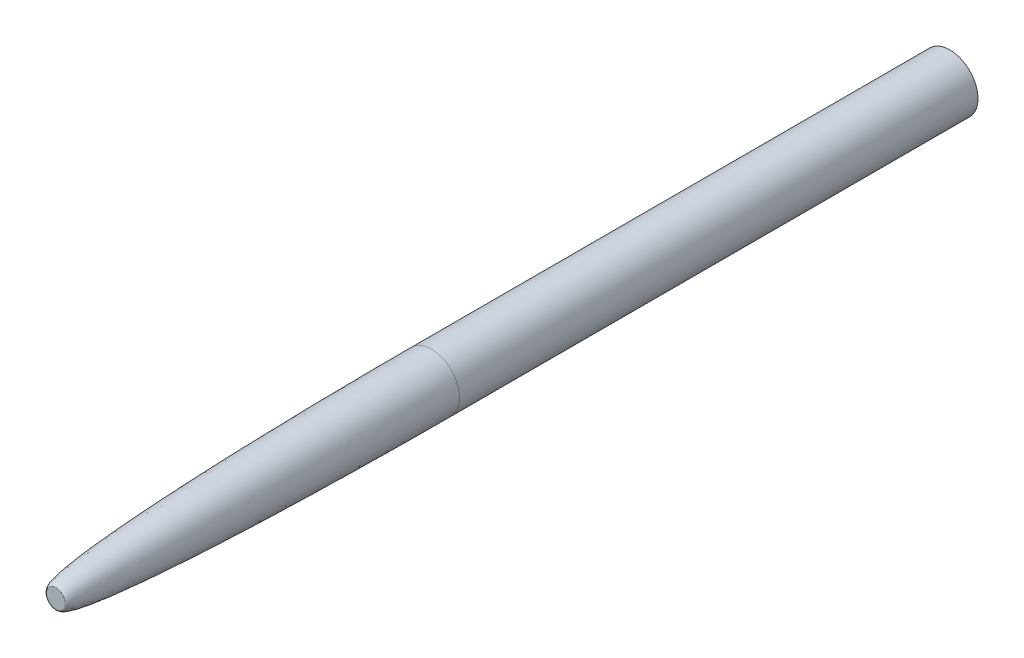
ISO-10303-21;
HEADER;
FILE_DESCRIPTION(('STEP AP214'),'2;1');
FILE_NAME('part.step','',(''),(''),'','','');
FILE_SCHEMA(('AUTOMOTIVE_DESIGN { 1 0 10303 214 1 1 1 1 }'));
ENDSEC;
DATA;
#1=APPLICATION_CONTEXT('core data for automotive mechanical design processes');
#2=APPLICATION_PROTOCOL_DEFINITION('international standard','automotive_design',2000,#1);
#3=PRODUCT_CONTEXT('',#1,'mechanical');
#4=PRODUCT('Part','Part','',(#3));
#5=PRODUCT_RELATED_PRODUCT_CATEGORY('part','',(#4));
#6=PRODUCT_DEFINITION_FORMATION('','',#4);
#7=PRODUCT_DEFINITION_CONTEXT('part definition',#1,'design');
#8=PRODUCT_DEFINITION('design','',#6,#7);
#9=PRODUCT_DEFINITION_SHAPE('','',#8);
#10=(LENGTH_UNIT() NAMED_UNIT(*) SI_UNIT(.MILLI.,.METRE.));
#11=(NAMED_UNIT(*) PLANE_ANGLE_UNIT() SI_UNIT($,.RADIAN.));
#12=(NAMED_UNIT(*) SI_UNIT($,.STERADIAN.) SOLID_ANGLE_UNIT());
#13=UNCERTAINTY_MEASURE_WITH_UNIT(LENGTH_MEASURE(1.E-05),#10,'distance_accuracy_value','');
#14=(GEOMETRIC_REPRESENTATION_CONTEXT(3) GLOBAL_UNCERTAINTY_ASSIGNED_CONTEXT((#13)) GLOBAL_UNIT_ASSIGNED_CONTEXT((#10,
#11,#12)) REPRESENTATION_CONTEXT('',''));
#15=CARTESIAN_POINT('',(0.,0.,0.));
#16=DIRECTION('',(0.,0.,1.));
#17=DIRECTION('',(1.,0.,0.));
#18=AXIS2_PLACEMENT_3D('',#15,#16,#17);
#19=CARTESIAN_POINT('',(0.,0.,23.8));
#20=DIRECTION('',(0.,0.,-1.));
#21=DIRECTION('',(-1.,0.,0.));
#22=AXIS2_PLACEMENT_3D('',#19,#20,#21);
#23=CYLINDRICAL_SURFACE('',#22,0.75);
#24=CARTESIAN_POINT('',(0.75,0.,13.8));
#25=CARTESIAN_POINT('',(0.75,0.196349017251001,13.8));
#26=CARTESIAN_POINT('',(0.669169807467412,0.39149036431241,13.8));
#27=CARTESIAN_POINT('',(0.39149036431241,0.669169807467412,13.8));
#28=CARTESIAN_POINT('',(0.196349017251005,0.75,13.8));
#29=CARTESIAN_POINT('',(-0.196349017251005,0.75,13.8));
#30=CARTESIAN_POINT('',(-0.391490364312412,0.66916980746741,13.8));
#31=CARTESIAN_POINT('',(-0.66916980746741,0.391490364312411,13.8));
#32=CARTESIAN_POINT('',(-0.75,0.196349017251005,13.8));
#33=CARTESIAN_POINT('',(-0.75,-0.196349017251005,13.8));
#34=CARTESIAN_POINT('',(-0.669169807467413,-0.391490364312408,13.8));
#35=CARTESIAN_POINT('',(-0.391490364312407,-0.669169807467414,13.8));
#36=CARTESIAN_POINT('',(-0.196349017251004,-0.75,13.8));
#37=CARTESIAN_POINT('',(0.196349017251007,-0.75,13.8));
#38=CARTESIAN_POINT('',(0.39149036431241,-0.669169807467411,13.8));
#39=CARTESIAN_POINT('',(0.669169807467408,-0.391490364312414,13.8));
#40=CARTESIAN_POINT('',(0.75,-0.196349017251001,13.8));
#41=CARTESIAN_POINT('',(0.75,0.,13.8));
#42=(BOUNDED_CURVE() B_SPLINE_CURVE(3,(#24,#25,#26,#27,#28,#29,#30,#31,#32,#33,#34,#35,#36,#37,
#38,#39,#40,#41),.UNSPECIFIED.,.T.,.F.) B_SPLINE_CURVE_WITH_KNOTS((4,2,2,2,2,2,2,2,4),(0.,
0.785398163397448,1.5707963267949,2.35619449019234,3.14159265358979,3.92699081698724,
4.71238898038469,5.49778714378214,6.28318530717959),
.UNSPECIFIED.) CURVE() GEOMETRIC_REPRESENTATION_ITEM() RATIONAL_B_SPLINE_CURVE((1.,1.,1.,1.,1.,
1.,1.,1.,1.,1.,1.,1.,1.,1.,1.,1.,1.,1.)) REPRESENTATION_ITEM(''));
#43=CARTESIAN_POINT('',(0.75,0.,13.8));
#44=VERTEX_POINT('',#43);
#45=EDGE_CURVE('E11',#44,#44,#42,.F.);
#46=ORIENTED_EDGE('',*,*,#45,.T.);
#47=EDGE_LOOP('',(#46));
#48=FACE_BOUND('',#47,.T.);
#49=CARTESIAN_POINT('',(0.,0.,0.));
#50=DIRECTION('',(0.,0.,1.));
#51=DIRECTION('',(1.,0.,0.));
#52=AXIS2_PLACEMENT_3D('',#49,#50,#51);
#53=CIRCLE('',#52,0.75);
#54=CARTESIAN_POINT('',(0.75,0.,0.));
#55=VERTEX_POINT('',#54);
#56=EDGE_CURVE('E54',#55,#55,#53,.T.);
#57=ORIENTED_EDGE('',*,*,#56,.T.);
#58=EDGE_LOOP('',(#57));
#59=FACE_BOUND('',#58,.T.);
#60=ADVANCED_FACE('F36',(#48,#59),#23,.T.);
#61=CARTESIAN_POINT('',(0.,0.,23.8));
#62=DIRECTION('',(0.,0.,1.));
#63=DIRECTION('',(1.,0.,0.));
#64=AXIS2_PLACEMENT_3D('',#61,#62,#63);
#65=PLANE('',#64);
#66=CARTESIAN_POINT('',(0.25,0.,23.8));
#67=CARTESIAN_POINT('',(0.25,-0.0654496724170002,23.8));
#68=CARTESIAN_POINT('',(0.223056602489137,-0.130496788104138,23.8));
#69=CARTESIAN_POINT('',(0.130496788104136,-0.223056602489137,23.8));
#70=CARTESIAN_POINT('',(0.0654496724170022,-0.25,23.8));
#71=CARTESIAN_POINT('',(-0.0654496724170014,-0.25,23.8));
#72=CARTESIAN_POINT('',(-0.130496788104136,-0.223056602489138,23.8));
#73=CARTESIAN_POINT('',(-0.223056602489137,-0.130496788104136,23.8));
#74=CARTESIAN_POINT('',(-0.25,-0.0654496724170018,23.8));
#75=CARTESIAN_POINT('',(-0.25,0.0654496724170018,23.8));
#76=CARTESIAN_POINT('',(-0.223056602489138,0.130496788104137,23.8));
#77=CARTESIAN_POINT('',(-0.130496788104137,0.223056602489136,23.8));
#78=CARTESIAN_POINT('',(-0.0654496724170018,0.25,23.8));
#79=CARTESIAN_POINT('',(0.0654496724170018,0.25,23.8));
#80=CARTESIAN_POINT('',(0.130496788104138,0.223056602489137,23.8));
#81=CARTESIAN_POINT('',(0.223056602489136,0.130496788104137,23.8));
#82=CARTESIAN_POINT('',(0.25,0.0654496724170002,23.8));
#83=CARTESIAN_POINT('',(0.25,0.,23.8));
#84=(BOUNDED_CURVE() B_SPLINE_CURVE(3,(#66,#67,#68,#69,#70,#71,#72,#73,#74,#75,#76,#77,#78,#79,
#80,#81,#82,#83),.UNSPECIFIED.,.T.,.F.) B_SPLINE_CURVE_WITH_KNOTS((4,2,2,2,2,2,2,2,4),(0.,
0.785398163397448,1.5707963267949,2.35619449019234,3.14159265358979,3.92699081698724,
4.71238898038469,5.49778714378214,6.28318530717959),
.UNSPECIFIED.) CURVE() GEOMETRIC_REPRESENTATION_ITEM() RATIONAL_B_SPLINE_CURVE((1.,1.,1.,1.,1.,
1.,1.,1.,1.,1.,1.,1.,1.,1.,1.,1.,1.,1.)) REPRESENTATION_ITEM(''));
#85=CARTESIAN_POINT('',(0.25,0.,23.8));
#86=VERTEX_POINT('',#85);
#87=EDGE_CURVE('E49',#86,#86,#84,.F.);
#88=ORIENTED_EDGE('',*,*,#87,.T.);
#89=EDGE_LOOP('',(#88));
#90=FACE_BOUND('',#89,.T.);
#91=ADVANCED_FACE('F67',(#90),#65,.T.);
#92=CARTESIAN_POINT('',(0.,0.,0.));
#93=DIRECTION('',(0.,0.,1.));
#94=DIRECTION('',(1.,0.,0.));
#95=AXIS2_PLACEMENT_3D('',#92,#93,#94);
#96=PLANE('',#95);
#97=ORIENTED_EDGE('',*,*,#56,.F.);
#98=EDGE_LOOP('',(#97));
#99=FACE_BOUND('',#98,.T.);
#100=ADVANCED_FACE('F76',(#99),#96,.F.);
#101=CARTESIAN_POINT('',(0.25,0.,23.8));
#102=CARTESIAN_POINT('',(0.25,0.0654496724170002,23.8));
#103=CARTESIAN_POINT('',(0.223056602489136,0.130496788104137,23.8));
#104=CARTESIAN_POINT('',(0.130496788104138,0.223056602489137,23.8));
#105=CARTESIAN_POINT('',(0.0654496724170018,0.25,23.8));
#106=CARTESIAN_POINT('',(-0.0654496724170018,0.25,23.8));
#107=CARTESIAN_POINT('',(-0.130496788104137,0.223056602489136,23.8));
#108=CARTESIAN_POINT('',(-0.223056602489138,0.130496788104137,23.8));
#109=CARTESIAN_POINT('',(-0.25,0.0654496724170018,23.8));
#110=CARTESIAN_POINT('',(-0.25,-0.0654496724170018,23.8));
#111=CARTESIAN_POINT('',(-0.223056602489137,-0.130496788104136,23.8));
#112=CARTESIAN_POINT('',(-0.130496788104136,-0.223056602489138,23.8));
#113=CARTESIAN_POINT('',(-0.0654496724170014,-0.25,23.8));
#114=CARTESIAN_POINT('',(0.0654496724170022,-0.25,23.8));
#115=CARTESIAN_POINT('',(0.130496788104136,-0.223056602489137,23.8));
#116=CARTESIAN_POINT('',(0.223056602489137,-0.130496788104138,23.8));
#117=CARTESIAN_POINT('',(0.25,-0.0654496724170002,23.8));
#118=CARTESIAN_POINT('',(0.25,0.,23.8));
#119=CARTESIAN_POINT('',(0.75,0.,23.8));
#120=CARTESIAN_POINT('',(0.75,0.196349017251001,23.8));
#121=CARTESIAN_POINT('',(0.669169807467417,0.391490364312411,23.8));
#122=CARTESIAN_POINT('',(0.391490364312404,0.66916980746741,23.8));
#123=CARTESIAN_POINT('',(0.196349017251005,0.75,23.8));
#124=CARTESIAN_POINT('',(-0.196349017251005,0.75,23.8));
#125=CARTESIAN_POINT('',(-0.391490364312412,0.66916980746741,23.8));
#126=CARTESIAN_POINT('',(-0.669169807467411,0.391490364312411,23.8));
#127=CARTESIAN_POINT('',(-0.75,0.196349017251005,23.8));
#128=CARTESIAN_POINT('',(-0.75,-0.196349017251005,23.8));
#129=CARTESIAN_POINT('',(-0.669169807467417,-0.391490364312408,23.8));
#130=CARTESIAN_POINT('',(-0.391490364312404,-0.669169807467414,23.8));
#131=CARTESIAN_POINT('',(-0.196349017251004,-0.75,23.8));
#132=CARTESIAN_POINT('',(0.196349017251007,-0.75,23.8));
#133=CARTESIAN_POINT('',(0.391490364312409,-0.669169807467409,23.8));
#134=CARTESIAN_POINT('',(0.66916980746741,-0.391490364312415,23.8));
#135=CARTESIAN_POINT('',(0.75,-0.196349017251001,23.8));
#136=CARTESIAN_POINT('',(0.75,0.,23.8));
#137=CARTESIAN_POINT('',(0.75,0.,13.8));
#138=CARTESIAN_POINT('',(0.75,0.196349017251001,13.8));
#139=CARTESIAN_POINT('',(0.669169807467412,0.39149036431241,13.8));
#140=CARTESIAN_POINT('',(0.39149036431241,0.669169807467412,13.8));
#141=CARTESIAN_POINT('',(0.196349017251005,0.75,13.8));
#142=CARTESIAN_POINT('',(-0.196349017251005,0.75,13.8));
#143=CARTESIAN_POINT('',(-0.391490364312412,0.66916980746741,13.8));
#144=CARTESIAN_POINT('',(-0.66916980746741,0.391490364312411,13.8));
#145=CARTESIAN_POINT('',(-0.75,0.196349017251005,13.8));
#146=CARTESIAN_POINT('',(-0.75,-0.196349017251005,13.8));
#147=CARTESIAN_POINT('',(-0.669169807467413,-0.391490364312408,13.8));
#148=CARTESIAN_POINT('',(-0.391490364312407,-0.669169807467414,13.8));
#149=CARTESIAN_POINT('',(-0.196349017251004,-0.75,13.8));
#150=CARTESIAN_POINT('',(0.196349017251007,-0.75,13.8));
#151=CARTESIAN_POINT('',(0.39149036431241,-0.669169807467411,13.8));
#152=CARTESIAN_POINT('',(0.669169807467408,-0.391490364312414,13.8));
#153=CARTESIAN_POINT('',(0.75,-0.196349017251001,13.8));
#154=CARTESIAN_POINT('',(0.75,0.,13.8));
#155=(BOUNDED_SURFACE() B_SPLINE_SURFACE(2,3,((#101,#102,#103,#104,#105,#106,#107,#108,#109,
#110,#111,#112,#113,#114,#115,#116,#117,#118),(#119,#120,#121,#122,#123,#124,#125,#126,#127,
#128,#129,#130,#131,#132,#133,#134,#135,#136),(#137,#138,#139,#140,#141,#142,#143,#144,#145,
#146,#147,#148,#149,#150,#151,#152,#153,#154)),.UNSPECIFIED.,.F.,.T.,
.F.) B_SPLINE_SURFACE_WITH_KNOTS((3,3),(4,2,2,2,2,2,2,2,4),(0.,1.),(0.,0.785398163397448,
1.5707963267949,2.35619449019234,3.14159265358979,3.92699081698724,4.71238898038469,
5.49778714378214,6.28318530717959),
.UNSPECIFIED.) GEOMETRIC_REPRESENTATION_ITEM() RATIONAL_B_SPLINE_SURFACE(((1.,1.,1.,1.,1.,1.,1.,
1.,1.,1.,1.,1.,1.,1.,1.,1.,1.,1.),(0.707106781186548,0.707106781186548,0.707106781186548,
0.707106781186548,0.707106781186548,0.707106781186548,0.707106781186548,0.707106781186548,
0.707106781186548,0.707106781186548,0.707106781186548,0.707106781186548,0.707106781186548,
0.707106781186548,0.707106781186548,0.707106781186548,0.707106781186548,0.707106781186548),(1.,
1.,1.,1.,1.,1.,1.,1.,1.,1.,1.,1.,1.,1.,1.,1.,1.,1.))) REPRESENTATION_ITEM('') SURFACE());
#156=ORIENTED_EDGE('',*,*,#45,.F.);
#157=EDGE_LOOP('',(#156));
#158=FACE_BOUND('',#157,.T.);
#159=ORIENTED_EDGE('',*,*,#87,.F.);
#160=EDGE_LOOP('',(#159));
#161=FACE_BOUND('',#160,.T.);
#162=ADVANCED_FACE('F39',(#158,#161),#155,.T.);
#163=CLOSED_SHELL('',(#60,#91,#100,#162));
#164=MANIFOLD_SOLID_BREP('B2',#163);
#165=ADVANCED_BREP_SHAPE_REPRESENTATION('',(#18,#164),#14);
#166=SHAPE_DEFINITION_REPRESENTATION(#9,#165);
ENDSEC;
END-ISO-10303-21;
